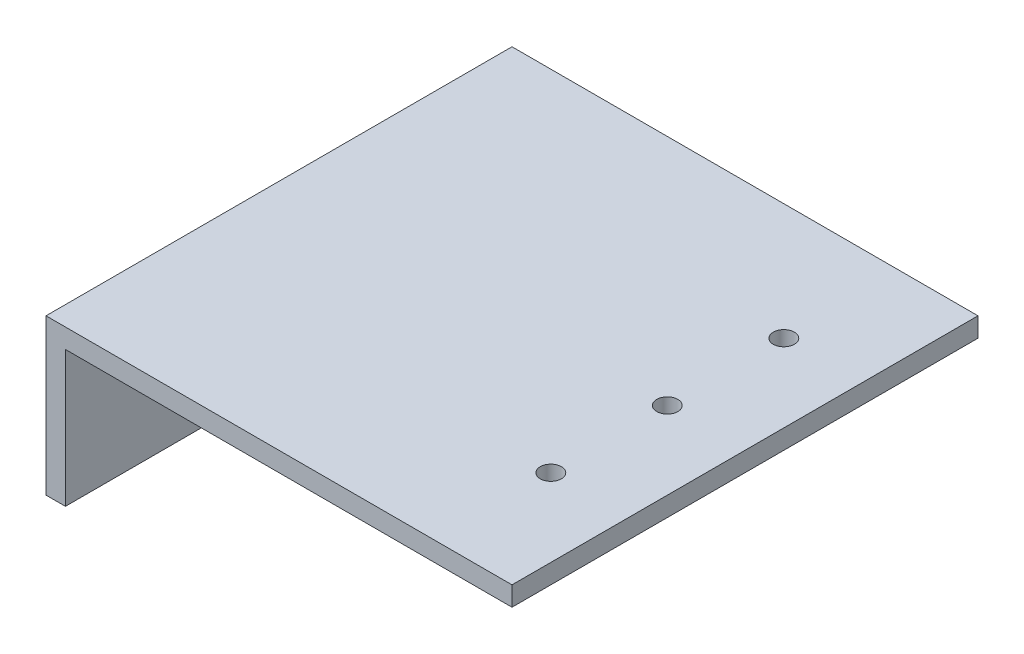
ISO-10303-21;
HEADER;
FILE_DESCRIPTION(('STEP AP214'),'2;1');
FILE_NAME('part.step','',(''),(''),'','','');
FILE_SCHEMA(('AUTOMOTIVE_DESIGN { 1 0 10303 214 1 1 1 1 }'));
ENDSEC;
DATA;
#1=APPLICATION_CONTEXT('core data for automotive mechanical design processes');
#2=APPLICATION_PROTOCOL_DEFINITION('international standard','automotive_design',2000,#1);
#3=PRODUCT_CONTEXT('',#1,'mechanical');
#4=PRODUCT('Part','Part','',(#3));
#5=PRODUCT_RELATED_PRODUCT_CATEGORY('part','',(#4));
#6=PRODUCT_DEFINITION_FORMATION('','',#4);
#7=PRODUCT_DEFINITION_CONTEXT('part definition',#1,'design');
#8=PRODUCT_DEFINITION('design','',#6,#7);
#9=PRODUCT_DEFINITION_SHAPE('','',#8);
#10=(LENGTH_UNIT() NAMED_UNIT(*) SI_UNIT(.MILLI.,.METRE.));
#11=(NAMED_UNIT(*) PLANE_ANGLE_UNIT() SI_UNIT($,.RADIAN.));
#12=(NAMED_UNIT(*) SI_UNIT($,.STERADIAN.) SOLID_ANGLE_UNIT());
#13=UNCERTAINTY_MEASURE_WITH_UNIT(LENGTH_MEASURE(1.E-05),#10,'distance_accuracy_value','');
#14=(GEOMETRIC_REPRESENTATION_CONTEXT(3) GLOBAL_UNCERTAINTY_ASSIGNED_CONTEXT((#13)) GLOBAL_UNIT_ASSIGNED_CONTEXT((#10,
#11,#12)) REPRESENTATION_CONTEXT('',''));
#15=CARTESIAN_POINT('',(0.,0.,0.));
#16=DIRECTION('',(0.,0.,1.));
#17=DIRECTION('',(1.,0.,0.));
#18=AXIS2_PLACEMENT_3D('',#15,#16,#17);
#19=CARTESIAN_POINT('',(0.,-3.17500000000001,76.2));
#20=DIRECTION('',(-1.,0.,0.));
#21=DIRECTION('',(0.,0.,1.));
#22=AXIS2_PLACEMENT_3D('',#19,#20,#21);
#23=PLANE('',#22);
#24=DIRECTION('',(0.,1.,0.));
#25=VECTOR('',#24,1.);
#26=CARTESIAN_POINT('',(0.,-3.17500000000001,0.));
#27=LINE('',#26,#25);
#28=CARTESIAN_POINT('',(0.,-3.17500000000001,0.));
#29=VERTEX_POINT('',#28);
#30=CARTESIAN_POINT('',(0.,0.,0.));
#31=VERTEX_POINT('',#30);
#32=EDGE_CURVE('E121',#29,#31,#27,.T.);
#33=ORIENTED_EDGE('',*,*,#32,.T.);
#34=DIRECTION('',(0.,0.,-1.));
#35=VECTOR('',#34,1.);
#36=CARTESIAN_POINT('',(0.,0.,76.2));
#37=LINE('',#36,#35);
#38=CARTESIAN_POINT('',(0.,0.,76.2));
#39=VERTEX_POINT('',#38);
#40=EDGE_CURVE('E11',#39,#31,#37,.T.);
#41=ORIENTED_EDGE('',*,*,#40,.F.);
#42=DIRECTION('',(0.,1.,0.));
#43=VECTOR('',#42,1.);
#44=CARTESIAN_POINT('',(0.,-3.17500000000001,76.2));
#45=LINE('',#44,#43);
#46=CARTESIAN_POINT('',(0.,-3.17500000000001,76.2));
#47=VERTEX_POINT('',#46);
#48=EDGE_CURVE('E132',#47,#39,#45,.T.);
#49=ORIENTED_EDGE('',*,*,#48,.F.);
#50=DIRECTION('',(0.,0.,-1.));
#51=VECTOR('',#50,1.);
#52=CARTESIAN_POINT('',(0.,-3.17500000000001,76.2));
#53=LINE('',#52,#51);
#54=EDGE_CURVE('E117',#47,#29,#53,.T.);
#55=ORIENTED_EDGE('',*,*,#54,.T.);
#56=EDGE_LOOP('',(#33,#41,#49,#55));
#57=FACE_BOUND('',#56,.T.);
#58=ADVANCED_FACE('F35',(#57),#23,.F.);
#59=CARTESIAN_POINT('',(0.,0.,76.2));
#60=DIRECTION('',(0.,-1.,0.));
#61=DIRECTION('',(1.,0.,0.));
#62=AXIS2_PLACEMENT_3D('',#59,#60,#61);
#63=PLANE('',#62);
#64=CARTESIAN_POINT('',(-12.7,0.,19.05));
#65=DIRECTION('',(0.,1.,0.));
#66=DIRECTION('',(0.,0.,1.));
#67=AXIS2_PLACEMENT_3D('',#64,#65,#66);
#68=CIRCLE('',#67,1.72719999999999);
#69=CARTESIAN_POINT('',(-12.7,0.,20.7772));
#70=VERTEX_POINT('',#69);
#71=EDGE_CURVE('E310',#70,#70,#68,.T.);
#72=ORIENTED_EDGE('',*,*,#71,.F.);
#73=EDGE_LOOP('',(#72));
#74=FACE_BOUND('',#73,.T.);
#75=CARTESIAN_POINT('',(-12.7,0.,38.1));
#76=DIRECTION('',(0.,1.,0.));
#77=DIRECTION('',(0.,0.,1.));
#78=AXIS2_PLACEMENT_3D('',#75,#76,#77);
#79=CIRCLE('',#78,1.72719999999999);
#80=CARTESIAN_POINT('',(-12.7,0.,39.8272));
#81=VERTEX_POINT('',#80);
#82=EDGE_CURVE('E150',#81,#81,#79,.T.);
#83=ORIENTED_EDGE('',*,*,#82,.F.);
#84=EDGE_LOOP('',(#83));
#85=FACE_BOUND('',#84,.T.);
#86=CARTESIAN_POINT('',(-12.7,0.,57.15));
#87=DIRECTION('',(0.,1.,0.));
#88=DIRECTION('',(0.,0.,1.));
#89=AXIS2_PLACEMENT_3D('',#86,#87,#88);
#90=CIRCLE('',#89,1.72719999999999);
#91=CARTESIAN_POINT('',(-12.7,0.,58.8772));
#92=VERTEX_POINT('',#91);
#93=EDGE_CURVE('E140',#92,#92,#90,.T.);
#94=ORIENTED_EDGE('',*,*,#93,.F.);
#95=EDGE_LOOP('',(#94));
#96=FACE_BOUND('',#95,.T.);
#97=DIRECTION('',(-1.,0.,0.));
#98=VECTOR('',#97,1.);
#99=CARTESIAN_POINT('',(0.,0.,0.));
#100=LINE('',#99,#98);
#101=CARTESIAN_POINT('',(-76.2,0.,0.));
#102=VERTEX_POINT('',#101);
#103=EDGE_CURVE('E124',#31,#102,#100,.T.);
#104=ORIENTED_EDGE('',*,*,#103,.T.);
#105=DIRECTION('',(0.,0.,-1.));
#106=VECTOR('',#105,1.);
#107=CARTESIAN_POINT('',(-76.2,0.,76.2));
#108=LINE('',#107,#106);
#109=CARTESIAN_POINT('',(-76.2,0.,76.2));
#110=VERTEX_POINT('',#109);
#111=EDGE_CURVE('E44',#110,#102,#108,.T.);
#112=ORIENTED_EDGE('',*,*,#111,.F.);
#113=DIRECTION('',(-1.,0.,0.));
#114=VECTOR('',#113,1.);
#115=CARTESIAN_POINT('',(0.,0.,76.2));
#116=LINE('',#115,#114);
#117=EDGE_CURVE('E90',#39,#110,#116,.T.);
#118=ORIENTED_EDGE('',*,*,#117,.F.);
#119=ORIENTED_EDGE('',*,*,#40,.T.);
#120=EDGE_LOOP('',(#104,#112,#118,#119));
#121=FACE_BOUND('',#120,.T.);
#122=ADVANCED_FACE('F159',(#74,#85,#96,#121),#63,.F.);
#123=CARTESIAN_POINT('',(-76.2,0.,76.2));
#124=DIRECTION('',(1.,0.,0.));
#125=DIRECTION('',(0.,0.,-1.));
#126=AXIS2_PLACEMENT_3D('',#123,#124,#125);
#127=PLANE('',#126);
#128=CARTESIAN_POINT('',(-76.2,-15.24,25.4));
#129=DIRECTION('',(-1.,0.,0.));
#130=DIRECTION('',(0.,0.,1.));
#131=AXIS2_PLACEMENT_3D('',#128,#129,#130);
#132=CIRCLE('',#131,1.72719999999999);
#133=CARTESIAN_POINT('',(-76.2,-15.24,27.1272));
#134=VERTEX_POINT('',#133);
#135=EDGE_CURVE('E324',#134,#134,#132,.T.);
#136=ORIENTED_EDGE('',*,*,#135,.F.);
#137=EDGE_LOOP('',(#136));
#138=FACE_BOUND('',#137,.T.);
#139=CARTESIAN_POINT('',(-76.2,-15.24,50.8));
#140=DIRECTION('',(-1.,0.,0.));
#141=DIRECTION('',(0.,0.,1.));
#142=AXIS2_PLACEMENT_3D('',#139,#140,#141);
#143=CIRCLE('',#142,1.72719999999999);
#144=CARTESIAN_POINT('',(-76.2,-15.24,52.5272));
#145=VERTEX_POINT('',#144);
#146=EDGE_CURVE('E318',#145,#145,#143,.T.);
#147=ORIENTED_EDGE('',*,*,#146,.F.);
#148=EDGE_LOOP('',(#147));
#149=FACE_BOUND('',#148,.T.);
#150=CARTESIAN_POINT('',(-76.2,-15.24,38.1));
#151=DIRECTION('',(-1.,0.,0.));
#152=DIRECTION('',(0.,0.,1.));
#153=AXIS2_PLACEMENT_3D('',#150,#151,#152);
#154=CIRCLE('',#153,3.175);
#155=CARTESIAN_POINT('',(-76.2,-15.24,41.275));
#156=VERTEX_POINT('',#155);
#157=EDGE_CURVE('E139',#156,#156,#154,.T.);
#158=ORIENTED_EDGE('',*,*,#157,.F.);
#159=EDGE_LOOP('',(#158));
#160=FACE_BOUND('',#159,.T.);
#161=DIRECTION('',(0.,-1.,0.));
#162=VECTOR('',#161,1.);
#163=CARTESIAN_POINT('',(-76.2,0.,0.));
#164=LINE('',#163,#162);
#165=CARTESIAN_POINT('',(-76.2,-25.4,0.));
#166=VERTEX_POINT('',#165);
#167=EDGE_CURVE('E127',#102,#166,#164,.T.);
#168=ORIENTED_EDGE('',*,*,#167,.T.);
#169=DIRECTION('',(0.,0.,-1.));
#170=VECTOR('',#169,1.);
#171=CARTESIAN_POINT('',(-76.2,-25.4,76.2));
#172=LINE('',#171,#170);
#173=CARTESIAN_POINT('',(-76.2,-25.4,76.2));
#174=VERTEX_POINT('',#173);
#175=EDGE_CURVE('E112',#174,#166,#172,.T.);
#176=ORIENTED_EDGE('',*,*,#175,.F.);
#177=DIRECTION('',(0.,-1.,0.));
#178=VECTOR('',#177,1.);
#179=CARTESIAN_POINT('',(-76.2,0.,76.2));
#180=LINE('',#179,#178);
#181=EDGE_CURVE('E103',#110,#174,#180,.T.);
#182=ORIENTED_EDGE('',*,*,#181,.F.);
#183=ORIENTED_EDGE('',*,*,#111,.T.);
#184=EDGE_LOOP('',(#168,#176,#182,#183));
#185=FACE_BOUND('',#184,.T.);
#186=ADVANCED_FACE('F162',(#138,#149,#160,#185),#127,.F.);
#187=CARTESIAN_POINT('',(-76.2,-25.4,76.2));
#188=DIRECTION('',(0.,1.,0.));
#189=DIRECTION('',(0.,0.,1.));
#190=AXIS2_PLACEMENT_3D('',#187,#188,#189);
#191=PLANE('',#190);
#192=DIRECTION('',(1.,0.,0.));
#193=VECTOR('',#192,1.);
#194=CARTESIAN_POINT('',(-76.2,-25.4,0.));
#195=LINE('',#194,#193);
#196=CARTESIAN_POINT('',(-73.025,-25.4,0.));
#197=VERTEX_POINT('',#196);
#198=EDGE_CURVE('E111',#166,#197,#195,.T.);
#199=ORIENTED_EDGE('',*,*,#198,.T.);
#200=DIRECTION('',(0.,0.,-1.));
#201=VECTOR('',#200,1.);
#202=CARTESIAN_POINT('',(-73.025,-25.4,76.2));
#203=LINE('',#202,#201);
#204=CARTESIAN_POINT('',(-73.025,-25.4,76.2));
#205=VERTEX_POINT('',#204);
#206=EDGE_CURVE('E108',#205,#197,#203,.T.);
#207=ORIENTED_EDGE('',*,*,#206,.F.);
#208=DIRECTION('',(1.,0.,0.));
#209=VECTOR('',#208,1.);
#210=CARTESIAN_POINT('',(-76.2,-25.4,76.2));
#211=LINE('',#210,#209);
#212=EDGE_CURVE('E97',#174,#205,#211,.T.);
#213=ORIENTED_EDGE('',*,*,#212,.F.);
#214=ORIENTED_EDGE('',*,*,#175,.T.);
#215=EDGE_LOOP('',(#199,#207,#213,#214));
#216=FACE_BOUND('',#215,.T.);
#217=ADVANCED_FACE('F109',(#216),#191,.F.);
#218=CARTESIAN_POINT('',(-73.025,-25.4,76.2));
#219=DIRECTION('',(-1.,0.,0.));
#220=DIRECTION('',(0.,0.,1.));
#221=AXIS2_PLACEMENT_3D('',#218,#219,#220);
#222=PLANE('',#221);
#223=CARTESIAN_POINT('',(-73.025,-15.24,25.4));
#224=DIRECTION('',(-1.,0.,0.));
#225=DIRECTION('',(0.,0.,1.));
#226=AXIS2_PLACEMENT_3D('',#223,#224,#225);
#227=CIRCLE('',#226,1.72719999999999);
#228=CARTESIAN_POINT('',(-73.025,-15.24,27.1272));
#229=VERTEX_POINT('',#228);
#230=EDGE_CURVE('E321',#229,#229,#227,.T.);
#231=ORIENTED_EDGE('',*,*,#230,.T.);
#232=EDGE_LOOP('',(#231));
#233=FACE_BOUND('',#232,.T.);
#234=CARTESIAN_POINT('',(-73.025,-15.24,50.8));
#235=DIRECTION('',(-1.,0.,0.));
#236=DIRECTION('',(0.,0.,1.));
#237=AXIS2_PLACEMENT_3D('',#234,#235,#236);
#238=CIRCLE('',#237,1.72719999999999);
#239=CARTESIAN_POINT('',(-73.025,-15.24,52.5272));
#240=VERTEX_POINT('',#239);
#241=EDGE_CURVE('E313',#240,#240,#238,.T.);
#242=ORIENTED_EDGE('',*,*,#241,.T.);
#243=EDGE_LOOP('',(#242));
#244=FACE_BOUND('',#243,.T.);
#245=CARTESIAN_POINT('',(-73.025,-15.24,38.1));
#246=DIRECTION('',(-1.,0.,0.));
#247=DIRECTION('',(0.,0.,1.));
#248=AXIS2_PLACEMENT_3D('',#245,#246,#247);
#249=CIRCLE('',#248,3.175);
#250=CARTESIAN_POINT('',(-73.025,-15.24,41.275));
#251=VERTEX_POINT('',#250);
#252=EDGE_CURVE('E125',#251,#251,#249,.F.);
#253=ORIENTED_EDGE('',*,*,#252,.F.);
#254=EDGE_LOOP('',(#253));
#255=FACE_BOUND('',#254,.T.);
#256=DIRECTION('',(0.,1.,0.));
#257=VECTOR('',#256,1.);
#258=CARTESIAN_POINT('',(-73.025,-25.4,0.));
#259=LINE('',#258,#257);
#260=CARTESIAN_POINT('',(-73.025,-3.17500000000001,0.));
#261=VERTEX_POINT('',#260);
#262=EDGE_CURVE('E76',#197,#261,#259,.T.);
#263=ORIENTED_EDGE('',*,*,#262,.T.);
#264=DIRECTION('',(0.,0.,-1.));
#265=VECTOR('',#264,1.);
#266=CARTESIAN_POINT('',(-73.025,-3.17500000000001,76.2));
#267=LINE('',#266,#265);
#268=CARTESIAN_POINT('',(-73.025,-3.17500000000001,76.2));
#269=VERTEX_POINT('',#268);
#270=EDGE_CURVE('E113',#269,#261,#267,.T.);
#271=ORIENTED_EDGE('',*,*,#270,.F.);
#272=DIRECTION('',(0.,1.,0.));
#273=VECTOR('',#272,1.);
#274=CARTESIAN_POINT('',(-73.025,-25.4,76.2));
#275=LINE('',#274,#273);
#276=EDGE_CURVE('E101',#205,#269,#275,.T.);
#277=ORIENTED_EDGE('',*,*,#276,.F.);
#278=ORIENTED_EDGE('',*,*,#206,.T.);
#279=EDGE_LOOP('',(#263,#271,#277,#278));
#280=FACE_BOUND('',#279,.T.);
#281=ADVANCED_FACE('F115',(#233,#244,#255,#280),#222,.F.);
#282=CARTESIAN_POINT('',(-73.025,-3.17500000000001,76.2));
#283=DIRECTION('',(0.,1.,0.));
#284=DIRECTION('',(-1.,0.,0.));
#285=AXIS2_PLACEMENT_3D('',#282,#283,#284);
#286=PLANE('',#285);
#287=CARTESIAN_POINT('',(-12.7,-3.17500000000001,19.05));
#288=DIRECTION('',(0.,1.,0.));
#289=DIRECTION('',(-1.,0.,0.));
#290=AXIS2_PLACEMENT_3D('',#287,#288,#289);
#291=CIRCLE('',#290,1.72719999999999);
#292=CARTESIAN_POINT('',(-14.4272,-3.17500000000001,19.05));
#293=VERTEX_POINT('',#292);
#294=EDGE_CURVE('E309',#293,#293,#291,.T.);
#295=ORIENTED_EDGE('',*,*,#294,.T.);
#296=EDGE_LOOP('',(#295));
#297=FACE_BOUND('',#296,.T.);
#298=CARTESIAN_POINT('',(-12.7,-3.17500000000001,38.1));
#299=DIRECTION('',(0.,1.,0.));
#300=DIRECTION('',(-1.,0.,0.));
#301=AXIS2_PLACEMENT_3D('',#298,#299,#300);
#302=CIRCLE('',#301,1.72719999999999);
#303=CARTESIAN_POINT('',(-14.4272,-3.17500000000001,38.1));
#304=VERTEX_POINT('',#303);
#305=EDGE_CURVE('E38',#304,#304,#302,.T.);
#306=ORIENTED_EDGE('',*,*,#305,.T.);
#307=EDGE_LOOP('',(#306));
#308=FACE_BOUND('',#307,.T.);
#309=CARTESIAN_POINT('',(-12.7,-3.17500000000001,57.15));
#310=DIRECTION('',(0.,1.,0.));
#311=DIRECTION('',(-1.,0.,0.));
#312=AXIS2_PLACEMENT_3D('',#309,#310,#311);
#313=CIRCLE('',#312,1.72719999999999);
#314=CARTESIAN_POINT('',(-14.4272,-3.17500000000001,57.15));
#315=VERTEX_POINT('',#314);
#316=EDGE_CURVE('E137',#315,#315,#313,.T.);
#317=ORIENTED_EDGE('',*,*,#316,.T.);
#318=EDGE_LOOP('',(#317));
#319=FACE_BOUND('',#318,.T.);
#320=DIRECTION('',(1.,0.,0.));
#321=VECTOR('',#320,1.);
#322=CARTESIAN_POINT('',(-73.025,-3.17500000000001,0.));
#323=LINE('',#322,#321);
#324=EDGE_CURVE('E82',#261,#29,#323,.T.);
#325=ORIENTED_EDGE('',*,*,#324,.T.);
#326=ORIENTED_EDGE('',*,*,#54,.F.);
#327=DIRECTION('',(1.,0.,0.));
#328=VECTOR('',#327,1.);
#329=CARTESIAN_POINT('',(-73.025,-3.17500000000001,76.2));
#330=LINE('',#329,#328);
#331=EDGE_CURVE('E53',#269,#47,#330,.T.);
#332=ORIENTED_EDGE('',*,*,#331,.F.);
#333=ORIENTED_EDGE('',*,*,#270,.T.);
#334=EDGE_LOOP('',(#325,#326,#332,#333));
#335=FACE_BOUND('',#334,.T.);
#336=ADVANCED_FACE('F167',(#297,#308,#319,#335),#286,.F.);
#337=CARTESIAN_POINT('',(0.,0.,76.2));
#338=DIRECTION('',(0.,0.,1.));
#339=DIRECTION('',(1.,0.,0.));
#340=AXIS2_PLACEMENT_3D('',#337,#338,#339);
#341=PLANE('',#340);
#342=ORIENTED_EDGE('',*,*,#48,.T.);
#343=ORIENTED_EDGE('',*,*,#117,.T.);
#344=ORIENTED_EDGE('',*,*,#181,.T.);
#345=ORIENTED_EDGE('',*,*,#212,.T.);
#346=ORIENTED_EDGE('',*,*,#276,.T.);
#347=ORIENTED_EDGE('',*,*,#331,.T.);
#348=EDGE_LOOP('',(#342,#343,#344,#345,#346,#347));
#349=FACE_BOUND('',#348,.T.);
#350=ADVANCED_FACE('F99',(#349),#341,.T.);
#351=CARTESIAN_POINT('',(0.,0.,0.));
#352=DIRECTION('',(0.,0.,1.));
#353=DIRECTION('',(1.,0.,0.));
#354=AXIS2_PLACEMENT_3D('',#351,#352,#353);
#355=PLANE('',#354);
#356=ORIENTED_EDGE('',*,*,#32,.F.);
#357=ORIENTED_EDGE('',*,*,#324,.F.);
#358=ORIENTED_EDGE('',*,*,#262,.F.);
#359=ORIENTED_EDGE('',*,*,#198,.F.);
#360=ORIENTED_EDGE('',*,*,#167,.F.);
#361=ORIENTED_EDGE('',*,*,#103,.F.);
#362=EDGE_LOOP('',(#356,#357,#358,#359,#360,#361));
#363=FACE_BOUND('',#362,.T.);
#364=ADVANCED_FACE('F165',(#363),#355,.F.);
#365=CARTESIAN_POINT('',(0.001000000000001,-15.24,38.1));
#366=DIRECTION('',(-1.,0.,0.));
#367=DIRECTION('',(0.,0.,1.));
#368=AXIS2_PLACEMENT_3D('',#365,#366,#367);
#369=CYLINDRICAL_SURFACE('',#368,3.175);
#370=ORIENTED_EDGE('',*,*,#157,.T.);
#371=EDGE_LOOP('',(#370));
#372=FACE_BOUND('',#371,.T.);
#373=ORIENTED_EDGE('',*,*,#252,.T.);
#374=EDGE_LOOP('',(#373));
#375=FACE_BOUND('',#374,.T.);
#376=ADVANCED_FACE('F247',(#372,#375),#369,.F.);
#377=CARTESIAN_POINT('',(-12.7,0.,57.15));
#378=DIRECTION('',(0.,1.,0.));
#379=DIRECTION('',(0.,0.,1.));
#380=AXIS2_PLACEMENT_3D('',#377,#378,#379);
#381=CYLINDRICAL_SURFACE('',#380,1.72719999999999);
#382=ORIENTED_EDGE('',*,*,#93,.T.);
#383=EDGE_LOOP('',(#382));
#384=FACE_BOUND('',#383,.T.);
#385=ORIENTED_EDGE('',*,*,#316,.F.);
#386=EDGE_LOOP('',(#385));
#387=FACE_BOUND('',#386,.T.);
#388=ADVANCED_FACE('F243',(#384,#387),#381,.F.);
#389=CARTESIAN_POINT('',(-12.7,0.,38.1));
#390=DIRECTION('',(0.,1.,0.));
#391=DIRECTION('',(0.,0.,1.));
#392=AXIS2_PLACEMENT_3D('',#389,#390,#391);
#393=CYLINDRICAL_SURFACE('',#392,1.72719999999999);
#394=ORIENTED_EDGE('',*,*,#82,.T.);
#395=EDGE_LOOP('',(#394));
#396=FACE_BOUND('',#395,.T.);
#397=ORIENTED_EDGE('',*,*,#305,.F.);
#398=EDGE_LOOP('',(#397));
#399=FACE_BOUND('',#398,.T.);
#400=ADVANCED_FACE('F239',(#396,#399),#393,.F.);
#401=CARTESIAN_POINT('',(-12.7,0.,19.05));
#402=DIRECTION('',(0.,1.,0.));
#403=DIRECTION('',(0.,0.,1.));
#404=AXIS2_PLACEMENT_3D('',#401,#402,#403);
#405=CYLINDRICAL_SURFACE('',#404,1.72719999999999);
#406=ORIENTED_EDGE('',*,*,#71,.T.);
#407=EDGE_LOOP('',(#406));
#408=FACE_BOUND('',#407,.T.);
#409=ORIENTED_EDGE('',*,*,#294,.F.);
#410=EDGE_LOOP('',(#409));
#411=FACE_BOUND('',#410,.T.);
#412=ADVANCED_FACE('F219',(#408,#411),#405,.F.);
#413=CARTESIAN_POINT('',(-76.2,-15.24,50.8));
#414=DIRECTION('',(-1.,0.,0.));
#415=DIRECTION('',(0.,0.,1.));
#416=AXIS2_PLACEMENT_3D('',#413,#414,#415);
#417=CYLINDRICAL_SURFACE('',#416,1.72719999999999);
#418=ORIENTED_EDGE('',*,*,#241,.F.);
#419=EDGE_LOOP('',(#418));
#420=FACE_BOUND('',#419,.T.);
#421=ORIENTED_EDGE('',*,*,#146,.T.);
#422=EDGE_LOOP('',(#421));
#423=FACE_BOUND('',#422,.T.);
#424=ADVANCED_FACE('F213',(#420,#423),#417,.F.);
#425=CARTESIAN_POINT('',(-76.2,-15.24,25.4));
#426=DIRECTION('',(-1.,0.,0.));
#427=DIRECTION('',(0.,0.,1.));
#428=AXIS2_PLACEMENT_3D('',#425,#426,#427);
#429=CYLINDRICAL_SURFACE('',#428,1.72719999999999);
#430=ORIENTED_EDGE('',*,*,#230,.F.);
#431=EDGE_LOOP('',(#430));
#432=FACE_BOUND('',#431,.T.);
#433=ORIENTED_EDGE('',*,*,#135,.T.);
#434=EDGE_LOOP('',(#433));
#435=FACE_BOUND('',#434,.T.);
#436=ADVANCED_FACE('F218',(#432,#435),#429,.F.);
#437=CLOSED_SHELL('',(#58,#122,#186,#217,#281,#336,#350,#364,#376,#388,#400,#412,#424,#436));
#438=MANIFOLD_SOLID_BREP('B2',#437);
#439=ADVANCED_BREP_SHAPE_REPRESENTATION('',(#18,#438),#14);
#440=SHAPE_DEFINITION_REPRESENTATION(#9,#439);
ENDSEC;
END-ISO-10303-21;
